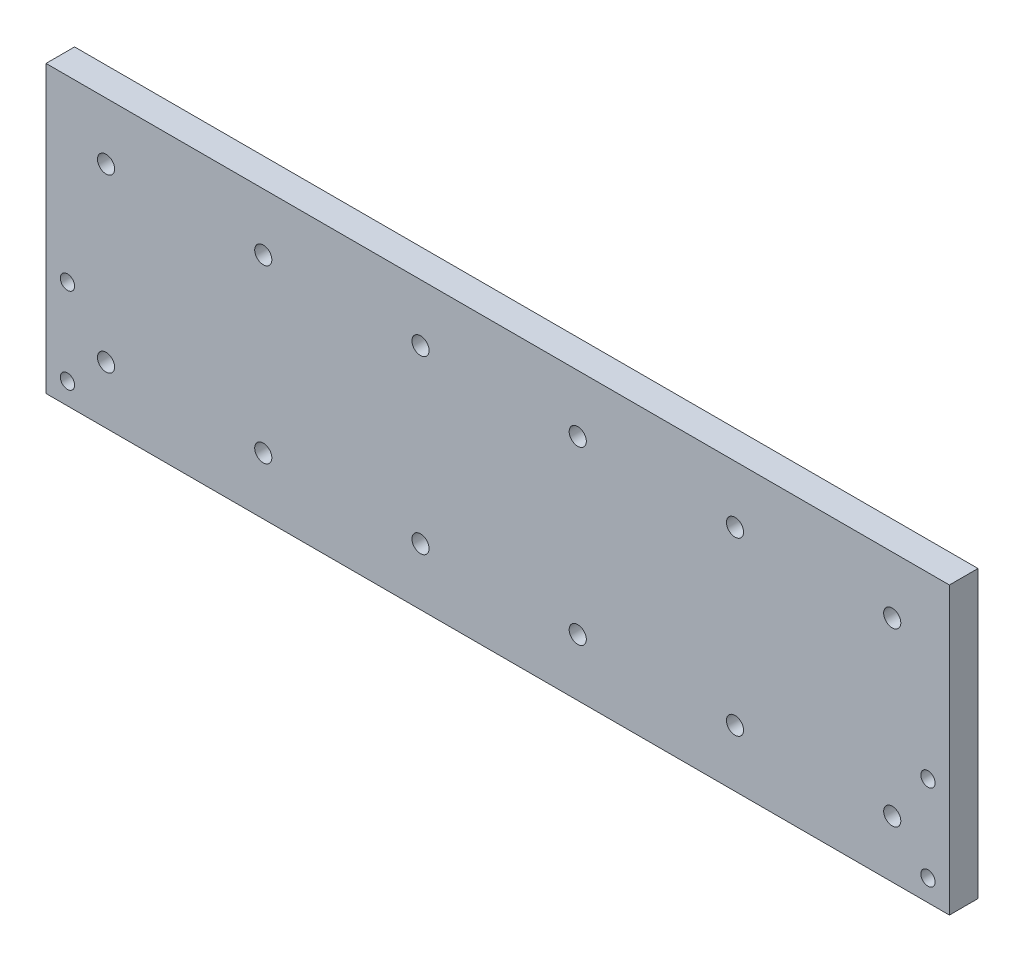
ISO-10303-21;
HEADER;
FILE_DESCRIPTION(('STEP AP214'),'2;1');
FILE_NAME('part.step','',(''),(''),'','','');
FILE_SCHEMA(('AUTOMOTIVE_DESIGN { 1 0 10303 214 1 1 1 1 }'));
ENDSEC;
DATA;
#1=APPLICATION_CONTEXT('core data for automotive mechanical design processes');
#2=APPLICATION_PROTOCOL_DEFINITION('international standard','automotive_design',2000,#1);
#3=PRODUCT_CONTEXT('',#1,'mechanical');
#4=PRODUCT('Part','Part','',(#3));
#5=PRODUCT_RELATED_PRODUCT_CATEGORY('part','',(#4));
#6=PRODUCT_DEFINITION_FORMATION('','',#4);
#7=PRODUCT_DEFINITION_CONTEXT('part definition',#1,'design');
#8=PRODUCT_DEFINITION('design','',#6,#7);
#9=PRODUCT_DEFINITION_SHAPE('','',#8);
#10=(LENGTH_UNIT() NAMED_UNIT(*) SI_UNIT(.MILLI.,.METRE.));
#11=(NAMED_UNIT(*) PLANE_ANGLE_UNIT() SI_UNIT($,.RADIAN.));
#12=(NAMED_UNIT(*) SI_UNIT($,.STERADIAN.) SOLID_ANGLE_UNIT());
#13=UNCERTAINTY_MEASURE_WITH_UNIT(LENGTH_MEASURE(1.E-05),#10,'distance_accuracy_value','');
#14=(GEOMETRIC_REPRESENTATION_CONTEXT(3) GLOBAL_UNCERTAINTY_ASSIGNED_CONTEXT((#13)) GLOBAL_UNIT_ASSIGNED_CONTEXT((#10,
#11,#12)) REPRESENTATION_CONTEXT('',''));
#15=CARTESIAN_POINT('',(0.,0.,0.));
#16=DIRECTION('',(0.,0.,1.));
#17=DIRECTION('',(1.,0.,0.));
#18=AXIS2_PLACEMENT_3D('',#15,#16,#17);
#19=CARTESIAN_POINT('',(-150.5,-42.5,-0.000999999999999265));
#20=DIRECTION('',(0.,0.,1.));
#21=DIRECTION('',(1.,0.,0.));
#22=AXIS2_PLACEMENT_3D('',#19,#20,#21);
#23=CYLINDRICAL_SURFACE('',#22,2.5);
#24=CARTESIAN_POINT('',(-150.5,-42.5,10.));
#25=DIRECTION('',(0.,0.,1.));
#26=DIRECTION('',(1.,0.,0.));
#27=AXIS2_PLACEMENT_3D('',#24,#25,#26);
#28=CIRCLE('',#27,2.5);
#29=CARTESIAN_POINT('',(-148.,-42.5,10.));
#30=VERTEX_POINT('',#29);
#31=EDGE_CURVE('E141',#30,#30,#28,.T.);
#32=ORIENTED_EDGE('',*,*,#31,.T.);
#33=EDGE_LOOP('',(#32));
#34=FACE_BOUND('',#33,.T.);
#35=CARTESIAN_POINT('',(-150.5,-42.5,5.));
#36=DIRECTION('',(0.,0.,-1.));
#37=DIRECTION('',(-1.,0.,0.));
#38=AXIS2_PLACEMENT_3D('',#35,#36,#37);
#39=CIRCLE('',#38,2.5);
#40=CARTESIAN_POINT('',(-153.,-42.5,5.));
#41=VERTEX_POINT('',#40);
#42=EDGE_CURVE('E42',#41,#41,#39,.F.);
#43=ORIENTED_EDGE('',*,*,#42,.F.);
#44=EDGE_LOOP('',(#43));
#45=FACE_BOUND('',#44,.T.);
#46=ADVANCED_FACE('F38',(#34,#45),#23,.F.);
#47=CARTESIAN_POINT('',(150.5,-12.5,-0.000999999999999265));
#48=DIRECTION('',(0.,0.,1.));
#49=DIRECTION('',(1.,0.,0.));
#50=AXIS2_PLACEMENT_3D('',#47,#48,#49);
#51=CYLINDRICAL_SURFACE('',#50,2.5);
#52=CARTESIAN_POINT('',(150.5,-12.5,10.));
#53=DIRECTION('',(0.,0.,1.));
#54=DIRECTION('',(1.,0.,0.));
#55=AXIS2_PLACEMENT_3D('',#52,#53,#54);
#56=CIRCLE('',#55,2.5);
#57=CARTESIAN_POINT('',(153.,-12.5,10.));
#58=VERTEX_POINT('',#57);
#59=EDGE_CURVE('E125',#58,#58,#56,.T.);
#60=ORIENTED_EDGE('',*,*,#59,.T.);
#61=EDGE_LOOP('',(#60));
#62=FACE_BOUND('',#61,.T.);
#63=CARTESIAN_POINT('',(150.5,-12.5,5.));
#64=DIRECTION('',(0.,0.,-1.));
#65=DIRECTION('',(-1.,0.,0.));
#66=AXIS2_PLACEMENT_3D('',#63,#64,#65);
#67=CIRCLE('',#66,2.5);
#68=CARTESIAN_POINT('',(148.,-12.5,5.));
#69=VERTEX_POINT('',#68);
#70=EDGE_CURVE('E120',#69,#69,#67,.F.);
#71=ORIENTED_EDGE('',*,*,#70,.F.);
#72=EDGE_LOOP('',(#71));
#73=FACE_BOUND('',#72,.T.);
#74=ADVANCED_FACE('F235',(#62,#73),#51,.F.);
#75=CARTESIAN_POINT('',(-150.5,-12.5,-0.000999999999999265));
#76=DIRECTION('',(0.,0.,1.));
#77=DIRECTION('',(1.,0.,0.));
#78=AXIS2_PLACEMENT_3D('',#75,#76,#77);
#79=CYLINDRICAL_SURFACE('',#78,2.5);
#80=CARTESIAN_POINT('',(-150.5,-12.5,10.));
#81=DIRECTION('',(0.,0.,1.));
#82=DIRECTION('',(1.,0.,0.));
#83=AXIS2_PLACEMENT_3D('',#80,#81,#82);
#84=CIRCLE('',#83,2.5);
#85=CARTESIAN_POINT('',(-148.,-12.5,10.));
#86=VERTEX_POINT('',#85);
#87=EDGE_CURVE('E129',#86,#86,#84,.T.);
#88=ORIENTED_EDGE('',*,*,#87,.T.);
#89=EDGE_LOOP('',(#88));
#90=FACE_BOUND('',#89,.T.);
#91=CARTESIAN_POINT('',(-150.5,-12.5,5.));
#92=DIRECTION('',(0.,0.,-1.));
#93=DIRECTION('',(-1.,0.,0.));
#94=AXIS2_PLACEMENT_3D('',#91,#92,#93);
#95=CIRCLE('',#94,2.5);
#96=CARTESIAN_POINT('',(-153.,-12.5,5.));
#97=VERTEX_POINT('',#96);
#98=EDGE_CURVE('E117',#97,#97,#95,.F.);
#99=ORIENTED_EDGE('',*,*,#98,.F.);
#100=EDGE_LOOP('',(#99));
#101=FACE_BOUND('',#100,.T.);
#102=ADVANCED_FACE('F241',(#90,#101),#79,.F.);
#103=CARTESIAN_POINT('',(150.5,-42.5,-0.000999999999999265));
#104=DIRECTION('',(0.,0.,1.));
#105=DIRECTION('',(1.,0.,0.));
#106=AXIS2_PLACEMENT_3D('',#103,#104,#105);
#107=CYLINDRICAL_SURFACE('',#106,2.5);
#108=CARTESIAN_POINT('',(150.5,-42.5,10.));
#109=DIRECTION('',(0.,0.,1.));
#110=DIRECTION('',(1.,0.,0.));
#111=AXIS2_PLACEMENT_3D('',#108,#109,#110);
#112=CIRCLE('',#111,2.5);
#113=CARTESIAN_POINT('',(153.,-42.5,10.));
#114=VERTEX_POINT('',#113);
#115=EDGE_CURVE('E134',#114,#114,#112,.T.);
#116=ORIENTED_EDGE('',*,*,#115,.T.);
#117=EDGE_LOOP('',(#116));
#118=FACE_BOUND('',#117,.T.);
#119=CARTESIAN_POINT('',(150.5,-42.5,5.));
#120=DIRECTION('',(0.,0.,-1.));
#121=DIRECTION('',(-1.,0.,0.));
#122=AXIS2_PLACEMENT_3D('',#119,#120,#121);
#123=CIRCLE('',#122,2.5);
#124=CARTESIAN_POINT('',(148.,-42.5,5.));
#125=VERTEX_POINT('',#124);
#126=EDGE_CURVE('E114',#125,#125,#123,.F.);
#127=ORIENTED_EDGE('',*,*,#126,.F.);
#128=EDGE_LOOP('',(#127));
#129=FACE_BOUND('',#128,.T.);
#130=ADVANCED_FACE('F301',(#118,#129),#107,.F.);
#131=CARTESIAN_POINT('',(158.,-50.,10.));
#132=DIRECTION('',(-1.,0.,0.));
#133=DIRECTION('',(0.,0.,1.));
#134=AXIS2_PLACEMENT_3D('',#131,#132,#133);
#135=PLANE('',#134);
#136=DIRECTION('',(0.,1.,0.));
#137=VECTOR('',#136,1.);
#138=CARTESIAN_POINT('',(158.,-50.,0.));
#139=LINE('',#138,#137);
#140=CARTESIAN_POINT('',(158.,-50.,0.));
#141=VERTEX_POINT('',#140);
#142=CARTESIAN_POINT('',(158.,50.,0.));
#143=VERTEX_POINT('',#142);
#144=EDGE_CURVE('E105',#141,#143,#139,.T.);
#145=ORIENTED_EDGE('',*,*,#144,.T.);
#146=DIRECTION('',(0.,0.,-1.));
#147=VECTOR('',#146,1.);
#148=CARTESIAN_POINT('',(158.,50.,10.));
#149=LINE('',#148,#147);
#150=CARTESIAN_POINT('',(158.,50.,10.));
#151=VERTEX_POINT('',#150);
#152=EDGE_CURVE('E11',#151,#143,#149,.T.);
#153=ORIENTED_EDGE('',*,*,#152,.F.);
#154=DIRECTION('',(0.,1.,0.));
#155=VECTOR('',#154,1.);
#156=CARTESIAN_POINT('',(158.,-50.,10.));
#157=LINE('',#156,#155);
#158=CARTESIAN_POINT('',(158.,-50.,10.));
#159=VERTEX_POINT('',#158);
#160=EDGE_CURVE('E92',#159,#151,#157,.T.);
#161=ORIENTED_EDGE('',*,*,#160,.F.);
#162=DIRECTION('',(0.,0.,-1.));
#163=VECTOR('',#162,1.);
#164=CARTESIAN_POINT('',(158.,-50.,10.));
#165=LINE('',#164,#163);
#166=EDGE_CURVE('E101',#159,#141,#165,.T.);
#167=ORIENTED_EDGE('',*,*,#166,.T.);
#168=EDGE_LOOP('',(#145,#153,#161,#167));
#169=FACE_BOUND('',#168,.T.);
#170=ADVANCED_FACE('F40',(#169),#135,.F.);
#171=CARTESIAN_POINT('',(-158.,50.,10.));
#172=DIRECTION('',(0.,-1.,0.));
#173=DIRECTION('',(0.,0.,-1.));
#174=AXIS2_PLACEMENT_3D('',#171,#172,#173);
#175=PLANE('',#174);
#176=DIRECTION('',(-1.,0.,0.));
#177=VECTOR('',#176,1.);
#178=CARTESIAN_POINT('',(-158.,50.,0.));
#179=LINE('',#178,#177);
#180=CARTESIAN_POINT('',(-158.,50.,0.));
#181=VERTEX_POINT('',#180);
#182=EDGE_CURVE('E96',#143,#181,#179,.T.);
#183=ORIENTED_EDGE('',*,*,#182,.T.);
#184=DIRECTION('',(0.,0.,-1.));
#185=VECTOR('',#184,1.);
#186=CARTESIAN_POINT('',(-158.,50.,10.));
#187=LINE('',#186,#185);
#188=CARTESIAN_POINT('',(-158.,50.,10.));
#189=VERTEX_POINT('',#188);
#190=EDGE_CURVE('E48',#189,#181,#187,.T.);
#191=ORIENTED_EDGE('',*,*,#190,.F.);
#192=DIRECTION('',(-1.,0.,0.));
#193=VECTOR('',#192,1.);
#194=CARTESIAN_POINT('',(-158.,50.,10.));
#195=LINE('',#194,#193);
#196=EDGE_CURVE('E87',#151,#189,#195,.T.);
#197=ORIENTED_EDGE('',*,*,#196,.F.);
#198=ORIENTED_EDGE('',*,*,#152,.T.);
#199=EDGE_LOOP('',(#183,#191,#197,#198));
#200=FACE_BOUND('',#199,.T.);
#201=ADVANCED_FACE('F95',(#200),#175,.F.);
#202=CARTESIAN_POINT('',(-158.,-50.,10.));
#203=DIRECTION('',(1.,0.,0.));
#204=DIRECTION('',(0.,0.,-1.));
#205=AXIS2_PLACEMENT_3D('',#202,#203,#204);
#206=PLANE('',#205);
#207=DIRECTION('',(0.,-1.,0.));
#208=VECTOR('',#207,1.);
#209=CARTESIAN_POINT('',(-158.,-50.,0.));
#210=LINE('',#209,#208);
#211=CARTESIAN_POINT('',(-158.,-50.,0.));
#212=VERTEX_POINT('',#211);
#213=EDGE_CURVE('E74',#181,#212,#210,.T.);
#214=ORIENTED_EDGE('',*,*,#213,.T.);
#215=DIRECTION('',(0.,0.,-1.));
#216=VECTOR('',#215,1.);
#217=CARTESIAN_POINT('',(-158.,-50.,10.));
#218=LINE('',#217,#216);
#219=CARTESIAN_POINT('',(-158.,-50.,10.));
#220=VERTEX_POINT('',#219);
#221=EDGE_CURVE('E97',#220,#212,#218,.T.);
#222=ORIENTED_EDGE('',*,*,#221,.F.);
#223=DIRECTION('',(0.,-1.,0.));
#224=VECTOR('',#223,1.);
#225=CARTESIAN_POINT('',(-158.,-50.,10.));
#226=LINE('',#225,#224);
#227=EDGE_CURVE('E90',#189,#220,#226,.T.);
#228=ORIENTED_EDGE('',*,*,#227,.F.);
#229=ORIENTED_EDGE('',*,*,#190,.T.);
#230=EDGE_LOOP('',(#214,#222,#228,#229));
#231=FACE_BOUND('',#230,.T.);
#232=ADVANCED_FACE('F99',(#231),#206,.F.);
#233=CARTESIAN_POINT('',(-158.,-50.,10.));
#234=DIRECTION('',(0.,1.,0.));
#235=DIRECTION('',(0.,0.,1.));
#236=AXIS2_PLACEMENT_3D('',#233,#234,#235);
#237=PLANE('',#236);
#238=DIRECTION('',(1.,0.,0.));
#239=VECTOR('',#238,1.);
#240=CARTESIAN_POINT('',(-158.,-50.,0.));
#241=LINE('',#240,#239);
#242=EDGE_CURVE('E80',#212,#141,#241,.T.);
#243=ORIENTED_EDGE('',*,*,#242,.T.);
#244=ORIENTED_EDGE('',*,*,#166,.F.);
#245=DIRECTION('',(1.,0.,0.));
#246=VECTOR('',#245,1.);
#247=CARTESIAN_POINT('',(-158.,-50.,10.));
#248=LINE('',#247,#246);
#249=EDGE_CURVE('E57',#220,#159,#248,.T.);
#250=ORIENTED_EDGE('',*,*,#249,.F.);
#251=ORIENTED_EDGE('',*,*,#221,.T.);
#252=EDGE_LOOP('',(#243,#244,#250,#251));
#253=FACE_BOUND('',#252,.T.);
#254=ADVANCED_FACE('F221',(#253),#237,.F.);
#255=CARTESIAN_POINT('',(0.,0.,10.));
#256=DIRECTION('',(0.,0.,-1.));
#257=DIRECTION('',(-1.,0.,0.));
#258=AXIS2_PLACEMENT_3D('',#255,#256,#257);
#259=PLANE('',#258);
#260=ORIENTED_EDGE('',*,*,#115,.F.);
#261=EDGE_LOOP('',(#260));
#262=FACE_BOUND('',#261,.T.);
#263=ORIENTED_EDGE('',*,*,#87,.F.);
#264=EDGE_LOOP('',(#263));
#265=FACE_BOUND('',#264,.T.);
#266=ORIENTED_EDGE('',*,*,#59,.F.);
#267=EDGE_LOOP('',(#266));
#268=FACE_BOUND('',#267,.T.);
#269=ORIENTED_EDGE('',*,*,#31,.F.);
#270=EDGE_LOOP('',(#269));
#271=FACE_BOUND('',#270,.T.);
#272=CARTESIAN_POINT('',(-26.9999999999999,-30.,10.));
#273=DIRECTION('',(0.,0.,-1.));
#274=DIRECTION('',(-1.,0.,0.));
#275=AXIS2_PLACEMENT_3D('',#272,#273,#274);
#276=CIRCLE('',#275,3.);
#277=CARTESIAN_POINT('',(-29.9999999999999,-30.,10.));
#278=VERTEX_POINT('',#277);
#279=EDGE_CURVE('E181',#278,#278,#276,.F.);
#280=ORIENTED_EDGE('',*,*,#279,.F.);
#281=EDGE_LOOP('',(#280));
#282=FACE_BOUND('',#281,.T.);
#283=CARTESIAN_POINT('',(-81.9999999999999,-30.,10.));
#284=DIRECTION('',(0.,0.,-1.));
#285=DIRECTION('',(-1.,0.,0.));
#286=AXIS2_PLACEMENT_3D('',#283,#284,#285);
#287=CIRCLE('',#286,3.00000000000001);
#288=CARTESIAN_POINT('',(-84.9999999999999,-30.,10.));
#289=VERTEX_POINT('',#288);
#290=EDGE_CURVE('E175',#289,#289,#287,.F.);
#291=ORIENTED_EDGE('',*,*,#290,.F.);
#292=EDGE_LOOP('',(#291));
#293=FACE_BOUND('',#292,.T.);
#294=CARTESIAN_POINT('',(-137.,30.,10.));
#295=DIRECTION('',(0.,0.,-1.));
#296=DIRECTION('',(-1.,0.,0.));
#297=AXIS2_PLACEMENT_3D('',#294,#295,#296);
#298=CIRCLE('',#297,2.99999999999999);
#299=CARTESIAN_POINT('',(-140.,30.,10.));
#300=VERTEX_POINT('',#299);
#301=EDGE_CURVE('E168',#300,#300,#298,.F.);
#302=ORIENTED_EDGE('',*,*,#301,.F.);
#303=EDGE_LOOP('',(#302));
#304=FACE_BOUND('',#303,.T.);
#305=CARTESIAN_POINT('',(-81.9999999999999,30.,10.));
#306=DIRECTION('',(0.,0.,-1.));
#307=DIRECTION('',(-1.,0.,0.));
#308=AXIS2_PLACEMENT_3D('',#305,#306,#307);
#309=CIRCLE('',#308,3.00000000000001);
#310=CARTESIAN_POINT('',(-84.9999999999999,30.,10.));
#311=VERTEX_POINT('',#310);
#312=EDGE_CURVE('E167',#311,#311,#309,.F.);
#313=ORIENTED_EDGE('',*,*,#312,.F.);
#314=EDGE_LOOP('',(#313));
#315=FACE_BOUND('',#314,.T.);
#316=CARTESIAN_POINT('',(-137.,-30.,10.));
#317=DIRECTION('',(0.,0.,-1.));
#318=DIRECTION('',(-1.,0.,0.));
#319=AXIS2_PLACEMENT_3D('',#316,#317,#318);
#320=CIRCLE('',#319,2.99999999999999);
#321=CARTESIAN_POINT('',(-140.,-30.,10.));
#322=VERTEX_POINT('',#321);
#323=EDGE_CURVE('E203',#322,#322,#320,.F.);
#324=ORIENTED_EDGE('',*,*,#323,.F.);
#325=EDGE_LOOP('',(#324));
#326=FACE_BOUND('',#325,.T.);
#327=CARTESIAN_POINT('',(83.,30.,10.));
#328=DIRECTION('',(0.,0.,-1.));
#329=DIRECTION('',(-1.,0.,0.));
#330=AXIS2_PLACEMENT_3D('',#327,#328,#329);
#331=CIRCLE('',#330,3.00000000000001);
#332=CARTESIAN_POINT('',(80.,30.,10.));
#333=VERTEX_POINT('',#332);
#334=EDGE_CURVE('E204',#333,#333,#331,.F.);
#335=ORIENTED_EDGE('',*,*,#334,.F.);
#336=EDGE_LOOP('',(#335));
#337=FACE_BOUND('',#336,.T.);
#338=CARTESIAN_POINT('',(28.0000000000001,30.,10.));
#339=DIRECTION('',(0.,0.,-1.));
#340=DIRECTION('',(-1.,0.,0.));
#341=AXIS2_PLACEMENT_3D('',#338,#339,#340);
#342=CIRCLE('',#341,3.);
#343=CARTESIAN_POINT('',(25.,30.,10.));
#344=VERTEX_POINT('',#343);
#345=EDGE_CURVE('E191',#344,#344,#342,.F.);
#346=ORIENTED_EDGE('',*,*,#345,.F.);
#347=EDGE_LOOP('',(#346));
#348=FACE_BOUND('',#347,.T.);
#349=CARTESIAN_POINT('',(-26.9999999999999,30.,10.));
#350=DIRECTION('',(0.,0.,-1.));
#351=DIRECTION('',(-1.,0.,0.));
#352=AXIS2_PLACEMENT_3D('',#349,#350,#351);
#353=CIRCLE('',#352,3.);
#354=CARTESIAN_POINT('',(-29.9999999999999,30.,10.));
#355=VERTEX_POINT('',#354);
#356=EDGE_CURVE('E192',#355,#355,#353,.F.);
#357=ORIENTED_EDGE('',*,*,#356,.F.);
#358=EDGE_LOOP('',(#357));
#359=FACE_BOUND('',#358,.T.);
#360=CARTESIAN_POINT('',(28.0000000000001,-30.,10.));
#361=DIRECTION('',(0.,0.,-1.));
#362=DIRECTION('',(-1.,0.,0.));
#363=AXIS2_PLACEMENT_3D('',#360,#361,#362);
#364=CIRCLE('',#363,3.);
#365=CARTESIAN_POINT('',(25.,-30.,10.));
#366=VERTEX_POINT('',#365);
#367=EDGE_CURVE('E149',#366,#366,#364,.F.);
#368=ORIENTED_EDGE('',*,*,#367,.F.);
#369=EDGE_LOOP('',(#368));
#370=FACE_BOUND('',#369,.T.);
#371=CARTESIAN_POINT('',(83.,-30.,10.));
#372=DIRECTION('',(0.,0.,-1.));
#373=DIRECTION('',(-1.,0.,0.));
#374=AXIS2_PLACEMENT_3D('',#371,#372,#373);
#375=CIRCLE('',#374,3.00000000000001);
#376=CARTESIAN_POINT('',(80.,-30.,10.));
#377=VERTEX_POINT('',#376);
#378=EDGE_CURVE('E150',#377,#377,#375,.F.);
#379=ORIENTED_EDGE('',*,*,#378,.F.);
#380=EDGE_LOOP('',(#379));
#381=FACE_BOUND('',#380,.T.);
#382=CARTESIAN_POINT('',(138.,-30.,10.));
#383=DIRECTION('',(0.,0.,-1.));
#384=DIRECTION('',(-1.,0.,0.));
#385=AXIS2_PLACEMENT_3D('',#382,#383,#384);
#386=CIRCLE('',#385,2.99999999999999);
#387=CARTESIAN_POINT('',(135.,-30.,10.));
#388=VERTEX_POINT('',#387);
#389=EDGE_CURVE('E157',#388,#388,#386,.F.);
#390=ORIENTED_EDGE('',*,*,#389,.F.);
#391=EDGE_LOOP('',(#390));
#392=FACE_BOUND('',#391,.T.);
#393=CARTESIAN_POINT('',(138.,30.,10.));
#394=DIRECTION('',(0.,0.,-1.));
#395=DIRECTION('',(-1.,0.,0.));
#396=AXIS2_PLACEMENT_3D('',#393,#394,#395);
#397=CIRCLE('',#396,2.99999999999999);
#398=CARTESIAN_POINT('',(135.,30.,10.));
#399=VERTEX_POINT('',#398);
#400=EDGE_CURVE('E108',#399,#399,#397,.F.);
#401=ORIENTED_EDGE('',*,*,#400,.F.);
#402=EDGE_LOOP('',(#401));
#403=FACE_BOUND('',#402,.T.);
#404=ORIENTED_EDGE('',*,*,#160,.T.);
#405=ORIENTED_EDGE('',*,*,#196,.T.);
#406=ORIENTED_EDGE('',*,*,#227,.T.);
#407=ORIENTED_EDGE('',*,*,#249,.T.);
#408=EDGE_LOOP('',(#404,#405,#406,#407));
#409=FACE_BOUND('',#408,.T.);
#410=ADVANCED_FACE('F88',(#262,#265,#268,#271,#282,#293,#304,#315,#326,#337,#348,#359,#370,#381,
#392,#403,#409),#259,.F.);
#411=CARTESIAN_POINT('',(0.,0.,0.));
#412=DIRECTION('',(0.,0.,-1.));
#413=DIRECTION('',(-1.,0.,0.));
#414=AXIS2_PLACEMENT_3D('',#411,#412,#413);
#415=PLANE('',#414);
#416=CARTESIAN_POINT('',(-150.5,-42.5,0.));
#417=DIRECTION('',(0.,0.,-1.));
#418=DIRECTION('',(-1.,0.,0.));
#419=AXIS2_PLACEMENT_3D('',#416,#417,#418);
#420=CIRCLE('',#419,4.49999999999999);
#421=CARTESIAN_POINT('',(-155.,-42.5,0.));
#422=VERTEX_POINT('',#421);
#423=EDGE_CURVE('E363',#422,#422,#420,.T.);
#424=ORIENTED_EDGE('',*,*,#423,.F.);
#425=EDGE_LOOP('',(#424));
#426=FACE_BOUND('',#425,.T.);
#427=CARTESIAN_POINT('',(-150.5,-12.5,0.));
#428=DIRECTION('',(0.,0.,-1.));
#429=DIRECTION('',(-1.,0.,0.));
#430=AXIS2_PLACEMENT_3D('',#427,#428,#429);
#431=CIRCLE('',#430,4.49999999999999);
#432=CARTESIAN_POINT('',(-155.,-12.5,0.));
#433=VERTEX_POINT('',#432);
#434=EDGE_CURVE('E357',#433,#433,#431,.T.);
#435=ORIENTED_EDGE('',*,*,#434,.F.);
#436=EDGE_LOOP('',(#435));
#437=FACE_BOUND('',#436,.T.);
#438=CARTESIAN_POINT('',(150.5,-12.5,0.));
#439=DIRECTION('',(0.,0.,-1.));
#440=DIRECTION('',(-1.,0.,0.));
#441=AXIS2_PLACEMENT_3D('',#438,#439,#440);
#442=CIRCLE('',#441,4.49999999999999);
#443=CARTESIAN_POINT('',(146.,-12.5,0.));
#444=VERTEX_POINT('',#443);
#445=EDGE_CURVE('E348',#444,#444,#442,.T.);
#446=ORIENTED_EDGE('',*,*,#445,.F.);
#447=EDGE_LOOP('',(#446));
#448=FACE_BOUND('',#447,.T.);
#449=CARTESIAN_POINT('',(150.5,-42.5,0.));
#450=DIRECTION('',(0.,0.,-1.));
#451=DIRECTION('',(-1.,0.,0.));
#452=AXIS2_PLACEMENT_3D('',#449,#450,#451);
#453=CIRCLE('',#452,4.49999999999999);
#454=CARTESIAN_POINT('',(146.,-42.5,0.));
#455=VERTEX_POINT('',#454);
#456=EDGE_CURVE('E138',#455,#455,#453,.T.);
#457=ORIENTED_EDGE('',*,*,#456,.F.);
#458=EDGE_LOOP('',(#457));
#459=FACE_BOUND('',#458,.T.);
#460=CARTESIAN_POINT('',(-26.9999999999999,-30.,0.));
#461=DIRECTION('',(0.,0.,-1.));
#462=DIRECTION('',(1.,0.,0.));
#463=AXIS2_PLACEMENT_3D('',#460,#461,#462);
#464=CIRCLE('',#463,3.);
#465=CARTESIAN_POINT('',(-23.9999999999999,-30.,0.));
#466=VERTEX_POINT('',#465);
#467=EDGE_CURVE('E153',#466,#466,#464,.T.);
#468=ORIENTED_EDGE('',*,*,#467,.F.);
#469=EDGE_LOOP('',(#468));
#470=FACE_BOUND('',#469,.T.);
#471=CARTESIAN_POINT('',(-81.9999999999999,-30.,0.));
#472=DIRECTION('',(0.,0.,-1.));
#473=DIRECTION('',(1.,0.,0.));
#474=AXIS2_PLACEMENT_3D('',#471,#472,#473);
#475=CIRCLE('',#474,3.00000000000001);
#476=CARTESIAN_POINT('',(-78.9999999999999,-30.,0.));
#477=VERTEX_POINT('',#476);
#478=EDGE_CURVE('E178',#477,#477,#475,.T.);
#479=ORIENTED_EDGE('',*,*,#478,.F.);
#480=EDGE_LOOP('',(#479));
#481=FACE_BOUND('',#480,.T.);
#482=CARTESIAN_POINT('',(-137.,30.,0.));
#483=DIRECTION('',(0.,0.,-1.));
#484=DIRECTION('',(-1.,0.,0.));
#485=AXIS2_PLACEMENT_3D('',#482,#483,#484);
#486=CIRCLE('',#485,2.99999999999999);
#487=CARTESIAN_POINT('',(-140.,30.,0.));
#488=VERTEX_POINT('',#487);
#489=EDGE_CURVE('E172',#488,#488,#486,.T.);
#490=ORIENTED_EDGE('',*,*,#489,.F.);
#491=EDGE_LOOP('',(#490));
#492=FACE_BOUND('',#491,.T.);
#493=CARTESIAN_POINT('',(-81.9999999999999,30.,0.));
#494=DIRECTION('',(0.,0.,-1.));
#495=DIRECTION('',(-1.,0.,0.));
#496=AXIS2_PLACEMENT_3D('',#493,#494,#495);
#497=CIRCLE('',#496,3.00000000000001);
#498=CARTESIAN_POINT('',(-84.9999999999999,30.,0.));
#499=VERTEX_POINT('',#498);
#500=EDGE_CURVE('E164',#499,#499,#497,.T.);
#501=ORIENTED_EDGE('',*,*,#500,.F.);
#502=EDGE_LOOP('',(#501));
#503=FACE_BOUND('',#502,.T.);
#504=CARTESIAN_POINT('',(-137.,-30.,0.));
#505=DIRECTION('',(0.,0.,-1.));
#506=DIRECTION('',(1.,0.,0.));
#507=AXIS2_PLACEMENT_3D('',#504,#505,#506);
#508=CIRCLE('',#507,2.99999999999999);
#509=CARTESIAN_POINT('',(-134.,-30.,0.));
#510=VERTEX_POINT('',#509);
#511=EDGE_CURVE('E200',#510,#510,#508,.T.);
#512=ORIENTED_EDGE('',*,*,#511,.F.);
#513=EDGE_LOOP('',(#512));
#514=FACE_BOUND('',#513,.T.);
#515=CARTESIAN_POINT('',(83.,30.,0.));
#516=DIRECTION('',(0.,0.,-1.));
#517=DIRECTION('',(-1.,0.,0.));
#518=AXIS2_PLACEMENT_3D('',#515,#516,#517);
#519=CIRCLE('',#518,3.00000000000001);
#520=CARTESIAN_POINT('',(80.,30.,0.));
#521=VERTEX_POINT('',#520);
#522=EDGE_CURVE('E195',#521,#521,#519,.T.);
#523=ORIENTED_EDGE('',*,*,#522,.F.);
#524=EDGE_LOOP('',(#523));
#525=FACE_BOUND('',#524,.T.);
#526=CARTESIAN_POINT('',(28.0000000000001,30.,0.));
#527=DIRECTION('',(0.,0.,-1.));
#528=DIRECTION('',(-1.,0.,0.));
#529=AXIS2_PLACEMENT_3D('',#526,#527,#528);
#530=CIRCLE('',#529,3.);
#531=CARTESIAN_POINT('',(25.,30.,0.));
#532=VERTEX_POINT('',#531);
#533=EDGE_CURVE('E188',#532,#532,#530,.T.);
#534=ORIENTED_EDGE('',*,*,#533,.F.);
#535=EDGE_LOOP('',(#534));
#536=FACE_BOUND('',#535,.T.);
#537=CARTESIAN_POINT('',(-26.9999999999999,30.,0.));
#538=DIRECTION('',(0.,0.,-1.));
#539=DIRECTION('',(-1.,0.,0.));
#540=AXIS2_PLACEMENT_3D('',#537,#538,#539);
#541=CIRCLE('',#540,3.);
#542=CARTESIAN_POINT('',(-29.9999999999999,30.,0.));
#543=VERTEX_POINT('',#542);
#544=EDGE_CURVE('E171',#543,#543,#541,.T.);
#545=ORIENTED_EDGE('',*,*,#544,.F.);
#546=EDGE_LOOP('',(#545));
#547=FACE_BOUND('',#546,.T.);
#548=CARTESIAN_POINT('',(28.0000000000001,-30.,0.));
#549=DIRECTION('',(0.,0.,-1.));
#550=DIRECTION('',(1.,0.,0.));
#551=AXIS2_PLACEMENT_3D('',#548,#549,#550);
#552=CIRCLE('',#551,3.);
#553=CARTESIAN_POINT('',(31.0000000000001,-30.,0.));
#554=VERTEX_POINT('',#553);
#555=EDGE_CURVE('E146',#554,#554,#552,.T.);
#556=ORIENTED_EDGE('',*,*,#555,.F.);
#557=EDGE_LOOP('',(#556));
#558=FACE_BOUND('',#557,.T.);
#559=CARTESIAN_POINT('',(83.,-30.,0.));
#560=DIRECTION('',(0.,0.,-1.));
#561=DIRECTION('',(1.,0.,0.));
#562=AXIS2_PLACEMENT_3D('',#559,#560,#561);
#563=CIRCLE('',#562,3.00000000000001);
#564=CARTESIAN_POINT('',(86.,-30.,0.));
#565=VERTEX_POINT('',#564);
#566=EDGE_CURVE('E154',#565,#565,#563,.T.);
#567=ORIENTED_EDGE('',*,*,#566,.F.);
#568=EDGE_LOOP('',(#567));
#569=FACE_BOUND('',#568,.T.);
#570=CARTESIAN_POINT('',(138.,-30.,0.));
#571=DIRECTION('',(0.,0.,-1.));
#572=DIRECTION('',(1.,0.,0.));
#573=AXIS2_PLACEMENT_3D('',#570,#571,#572);
#574=CIRCLE('',#573,2.99999999999999);
#575=CARTESIAN_POINT('',(141.,-30.,0.));
#576=VERTEX_POINT('',#575);
#577=EDGE_CURVE('E145',#576,#576,#574,.T.);
#578=ORIENTED_EDGE('',*,*,#577,.F.);
#579=EDGE_LOOP('',(#578));
#580=FACE_BOUND('',#579,.T.);
#581=CARTESIAN_POINT('',(138.,30.,0.));
#582=DIRECTION('',(0.,0.,-1.));
#583=DIRECTION('',(-1.,0.,0.));
#584=AXIS2_PLACEMENT_3D('',#581,#582,#583);
#585=CIRCLE('',#584,2.99999999999999);
#586=CARTESIAN_POINT('',(135.,30.,0.));
#587=VERTEX_POINT('',#586);
#588=EDGE_CURVE('E207',#587,#587,#585,.T.);
#589=ORIENTED_EDGE('',*,*,#588,.F.);
#590=EDGE_LOOP('',(#589));
#591=FACE_BOUND('',#590,.T.);
#592=ORIENTED_EDGE('',*,*,#144,.F.);
#593=ORIENTED_EDGE('',*,*,#242,.F.);
#594=ORIENTED_EDGE('',*,*,#213,.F.);
#595=ORIENTED_EDGE('',*,*,#182,.F.);
#596=EDGE_LOOP('',(#592,#593,#594,#595));
#597=FACE_BOUND('',#596,.T.);
#598=ADVANCED_FACE('F220',(#426,#437,#448,#459,#470,#481,#492,#503,#514,#525,#536,#547,#558,
#569,#580,#591,#597),#415,.T.);
#599=CARTESIAN_POINT('',(138.,30.,10.001));
#600=DIRECTION('',(0.,0.,-1.));
#601=DIRECTION('',(-1.,0.,0.));
#602=AXIS2_PLACEMENT_3D('',#599,#600,#601);
#603=CYLINDRICAL_SURFACE('',#602,2.99999999999999);
#604=ORIENTED_EDGE('',*,*,#588,.T.);
#605=EDGE_LOOP('',(#604));
#606=FACE_BOUND('',#605,.T.);
#607=ORIENTED_EDGE('',*,*,#400,.T.);
#608=EDGE_LOOP('',(#607));
#609=FACE_BOUND('',#608,.T.);
#610=ADVANCED_FACE('F217',(#606,#609),#603,.F.);
#611=CARTESIAN_POINT('',(138.,-30.,10.001));
#612=DIRECTION('',(0.,0.,-1.));
#613=DIRECTION('',(-1.,0.,0.));
#614=AXIS2_PLACEMENT_3D('',#611,#612,#613);
#615=CYLINDRICAL_SURFACE('',#614,2.99999999999999);
#616=ORIENTED_EDGE('',*,*,#577,.T.);
#617=EDGE_LOOP('',(#616));
#618=FACE_BOUND('',#617,.T.);
#619=ORIENTED_EDGE('',*,*,#389,.T.);
#620=EDGE_LOOP('',(#619));
#621=FACE_BOUND('',#620,.T.);
#622=ADVANCED_FACE('F255',(#618,#621),#615,.F.);
#623=CARTESIAN_POINT('',(83.,-30.,10.001));
#624=DIRECTION('',(0.,0.,-1.));
#625=DIRECTION('',(-1.,0.,0.));
#626=AXIS2_PLACEMENT_3D('',#623,#624,#625);
#627=CYLINDRICAL_SURFACE('',#626,3.00000000000001);
#628=ORIENTED_EDGE('',*,*,#566,.T.);
#629=EDGE_LOOP('',(#628));
#630=FACE_BOUND('',#629,.T.);
#631=ORIENTED_EDGE('',*,*,#378,.T.);
#632=EDGE_LOOP('',(#631));
#633=FACE_BOUND('',#632,.T.);
#634=ADVANCED_FACE('F251',(#630,#633),#627,.F.);
#635=CARTESIAN_POINT('',(28.0000000000001,-30.,10.001));
#636=DIRECTION('',(0.,0.,-1.));
#637=DIRECTION('',(-1.,0.,0.));
#638=AXIS2_PLACEMENT_3D('',#635,#636,#637);
#639=CYLINDRICAL_SURFACE('',#638,3.);
#640=ORIENTED_EDGE('',*,*,#555,.T.);
#641=EDGE_LOOP('',(#640));
#642=FACE_BOUND('',#641,.T.);
#643=ORIENTED_EDGE('',*,*,#367,.T.);
#644=EDGE_LOOP('',(#643));
#645=FACE_BOUND('',#644,.T.);
#646=ADVANCED_FACE('F247',(#642,#645),#639,.F.);
#647=CARTESIAN_POINT('',(-26.9999999999999,30.,10.001));
#648=DIRECTION('',(0.,0.,-1.));
#649=DIRECTION('',(-1.,0.,0.));
#650=AXIS2_PLACEMENT_3D('',#647,#648,#649);
#651=CYLINDRICAL_SURFACE('',#650,3.);
#652=ORIENTED_EDGE('',*,*,#544,.T.);
#653=EDGE_LOOP('',(#652));
#654=FACE_BOUND('',#653,.T.);
#655=ORIENTED_EDGE('',*,*,#356,.T.);
#656=EDGE_LOOP('',(#655));
#657=FACE_BOUND('',#656,.T.);
#658=ADVANCED_FACE('F250',(#654,#657),#651,.F.);
#659=CARTESIAN_POINT('',(28.0000000000001,30.,10.001));
#660=DIRECTION('',(0.,0.,-1.));
#661=DIRECTION('',(-1.,0.,0.));
#662=AXIS2_PLACEMENT_3D('',#659,#660,#661);
#663=CYLINDRICAL_SURFACE('',#662,3.);
#664=ORIENTED_EDGE('',*,*,#533,.T.);
#665=EDGE_LOOP('',(#664));
#666=FACE_BOUND('',#665,.T.);
#667=ORIENTED_EDGE('',*,*,#345,.T.);
#668=EDGE_LOOP('',(#667));
#669=FACE_BOUND('',#668,.T.);
#670=ADVANCED_FACE('F278',(#666,#669),#663,.F.);
#671=CARTESIAN_POINT('',(83.,30.,10.001));
#672=DIRECTION('',(0.,0.,-1.));
#673=DIRECTION('',(-1.,0.,0.));
#674=AXIS2_PLACEMENT_3D('',#671,#672,#673);
#675=CYLINDRICAL_SURFACE('',#674,3.00000000000001);
#676=ORIENTED_EDGE('',*,*,#522,.T.);
#677=EDGE_LOOP('',(#676));
#678=FACE_BOUND('',#677,.T.);
#679=ORIENTED_EDGE('',*,*,#334,.T.);
#680=EDGE_LOOP('',(#679));
#681=FACE_BOUND('',#680,.T.);
#682=ADVANCED_FACE('F281',(#678,#681),#675,.F.);
#683=CARTESIAN_POINT('',(-137.,-30.,10.001));
#684=DIRECTION('',(0.,0.,-1.));
#685=DIRECTION('',(-1.,0.,0.));
#686=AXIS2_PLACEMENT_3D('',#683,#684,#685);
#687=CYLINDRICAL_SURFACE('',#686,2.99999999999999);
#688=ORIENTED_EDGE('',*,*,#511,.T.);
#689=EDGE_LOOP('',(#688));
#690=FACE_BOUND('',#689,.T.);
#691=ORIENTED_EDGE('',*,*,#323,.T.);
#692=EDGE_LOOP('',(#691));
#693=FACE_BOUND('',#692,.T.);
#694=ADVANCED_FACE('F264',(#690,#693),#687,.F.);
#695=CARTESIAN_POINT('',(-81.9999999999999,30.,10.001));
#696=DIRECTION('',(0.,0.,-1.));
#697=DIRECTION('',(-1.,0.,0.));
#698=AXIS2_PLACEMENT_3D('',#695,#696,#697);
#699=CYLINDRICAL_SURFACE('',#698,3.00000000000001);
#700=ORIENTED_EDGE('',*,*,#500,.T.);
#701=EDGE_LOOP('',(#700));
#702=FACE_BOUND('',#701,.T.);
#703=ORIENTED_EDGE('',*,*,#312,.T.);
#704=EDGE_LOOP('',(#703));
#705=FACE_BOUND('',#704,.T.);
#706=ADVANCED_FACE('F260',(#702,#705),#699,.F.);
#707=CARTESIAN_POINT('',(-137.,30.,10.001));
#708=DIRECTION('',(0.,0.,-1.));
#709=DIRECTION('',(-1.,0.,0.));
#710=AXIS2_PLACEMENT_3D('',#707,#708,#709);
#711=CYLINDRICAL_SURFACE('',#710,2.99999999999999);
#712=ORIENTED_EDGE('',*,*,#489,.T.);
#713=EDGE_LOOP('',(#712));
#714=FACE_BOUND('',#713,.T.);
#715=ORIENTED_EDGE('',*,*,#301,.T.);
#716=EDGE_LOOP('',(#715));
#717=FACE_BOUND('',#716,.T.);
#718=ADVANCED_FACE('F263',(#714,#717),#711,.F.);
#719=CARTESIAN_POINT('',(-81.9999999999999,-30.,10.001));
#720=DIRECTION('',(0.,0.,-1.));
#721=DIRECTION('',(-1.,0.,0.));
#722=AXIS2_PLACEMENT_3D('',#719,#720,#721);
#723=CYLINDRICAL_SURFACE('',#722,3.00000000000001);
#724=ORIENTED_EDGE('',*,*,#478,.T.);
#725=EDGE_LOOP('',(#724));
#726=FACE_BOUND('',#725,.T.);
#727=ORIENTED_EDGE('',*,*,#290,.T.);
#728=EDGE_LOOP('',(#727));
#729=FACE_BOUND('',#728,.T.);
#730=ADVANCED_FACE('F268',(#726,#729),#723,.F.);
#731=CARTESIAN_POINT('',(-26.9999999999999,-30.,10.001));
#732=DIRECTION('',(0.,0.,-1.));
#733=DIRECTION('',(-1.,0.,0.));
#734=AXIS2_PLACEMENT_3D('',#731,#732,#733);
#735=CYLINDRICAL_SURFACE('',#734,3.);
#736=ORIENTED_EDGE('',*,*,#467,.T.);
#737=EDGE_LOOP('',(#736));
#738=FACE_BOUND('',#737,.T.);
#739=ORIENTED_EDGE('',*,*,#279,.T.);
#740=EDGE_LOOP('',(#739));
#741=FACE_BOUND('',#740,.T.);
#742=ADVANCED_FACE('F272',(#738,#741),#735,.F.);
#743=CARTESIAN_POINT('',(150.5,-42.5,5.));
#744=DIRECTION('',(0.,0.,-1.));
#745=DIRECTION('',(-1.,0.,0.));
#746=AXIS2_PLACEMENT_3D('',#743,#744,#745);
#747=PLANE('',#746);
#748=CARTESIAN_POINT('',(150.5,-42.5,5.));
#749=DIRECTION('',(0.,0.,-1.));
#750=DIRECTION('',(-1.,0.,0.));
#751=AXIS2_PLACEMENT_3D('',#748,#749,#750);
#752=CIRCLE('',#751,4.49999999999999);
#753=CARTESIAN_POINT('',(146.,-42.5,5.));
#754=VERTEX_POINT('',#753);
#755=EDGE_CURVE('E118',#754,#754,#752,.T.);
#756=ORIENTED_EDGE('',*,*,#755,.T.);
#757=EDGE_LOOP('',(#756));
#758=FACE_BOUND('',#757,.T.);
#759=ORIENTED_EDGE('',*,*,#126,.T.);
#760=EDGE_LOOP('',(#759));
#761=FACE_BOUND('',#760,.T.);
#762=ADVANCED_FACE('F276',(#758,#761),#747,.T.);
#763=CARTESIAN_POINT('',(150.5,-42.5,5.));
#764=DIRECTION('',(0.,0.,-1.));
#765=DIRECTION('',(-1.,0.,0.));
#766=AXIS2_PLACEMENT_3D('',#763,#764,#765);
#767=CYLINDRICAL_SURFACE('',#766,4.49999999999999);
#768=ORIENTED_EDGE('',*,*,#755,.F.);
#769=EDGE_LOOP('',(#768));
#770=FACE_BOUND('',#769,.T.);
#771=ORIENTED_EDGE('',*,*,#456,.T.);
#772=EDGE_LOOP('',(#771));
#773=FACE_BOUND('',#772,.T.);
#774=ADVANCED_FACE('F313',(#770,#773),#767,.F.);
#775=CARTESIAN_POINT('',(-150.5,-12.5,5.));
#776=DIRECTION('',(0.,0.,-1.));
#777=DIRECTION('',(-1.,0.,0.));
#778=AXIS2_PLACEMENT_3D('',#775,#776,#777);
#779=PLANE('',#778);
#780=CARTESIAN_POINT('',(-150.5,-12.5,5.));
#781=DIRECTION('',(0.,0.,-1.));
#782=DIRECTION('',(-1.,0.,0.));
#783=AXIS2_PLACEMENT_3D('',#780,#781,#782);
#784=CIRCLE('',#783,4.49999999999999);
#785=CARTESIAN_POINT('',(-155.,-12.5,5.));
#786=VERTEX_POINT('',#785);
#787=EDGE_CURVE('E352',#786,#786,#784,.T.);
#788=ORIENTED_EDGE('',*,*,#787,.T.);
#789=EDGE_LOOP('',(#788));
#790=FACE_BOUND('',#789,.T.);
#791=ORIENTED_EDGE('',*,*,#98,.T.);
#792=EDGE_LOOP('',(#791));
#793=FACE_BOUND('',#792,.T.);
#794=ADVANCED_FACE('F316',(#790,#793),#779,.T.);
#795=CARTESIAN_POINT('',(-150.5,-12.5,5.));
#796=DIRECTION('',(0.,0.,-1.));
#797=DIRECTION('',(-1.,0.,0.));
#798=AXIS2_PLACEMENT_3D('',#795,#796,#797);
#799=CYLINDRICAL_SURFACE('',#798,4.49999999999999);
#800=ORIENTED_EDGE('',*,*,#787,.F.);
#801=EDGE_LOOP('',(#800));
#802=FACE_BOUND('',#801,.T.);
#803=ORIENTED_EDGE('',*,*,#434,.T.);
#804=EDGE_LOOP('',(#803));
#805=FACE_BOUND('',#804,.T.);
#806=ADVANCED_FACE('F330',(#802,#805),#799,.F.);
#807=CARTESIAN_POINT('',(150.5,-12.5,5.));
#808=DIRECTION('',(0.,0.,-1.));
#809=DIRECTION('',(-1.,0.,0.));
#810=AXIS2_PLACEMENT_3D('',#807,#808,#809);
#811=PLANE('',#810);
#812=CARTESIAN_POINT('',(150.5,-12.5,5.));
#813=DIRECTION('',(0.,0.,-1.));
#814=DIRECTION('',(-1.,0.,0.));
#815=AXIS2_PLACEMENT_3D('',#812,#813,#814);
#816=CIRCLE('',#815,4.49999999999999);
#817=CARTESIAN_POINT('',(146.,-12.5,5.));
#818=VERTEX_POINT('',#817);
#819=EDGE_CURVE('E347',#818,#818,#816,.T.);
#820=ORIENTED_EDGE('',*,*,#819,.T.);
#821=EDGE_LOOP('',(#820));
#822=FACE_BOUND('',#821,.T.);
#823=ORIENTED_EDGE('',*,*,#70,.T.);
#824=EDGE_LOOP('',(#823));
#825=FACE_BOUND('',#824,.T.);
#826=ADVANCED_FACE('F333',(#822,#825),#811,.T.);
#827=CARTESIAN_POINT('',(150.5,-12.5,5.));
#828=DIRECTION('',(0.,0.,-1.));
#829=DIRECTION('',(-1.,0.,0.));
#830=AXIS2_PLACEMENT_3D('',#827,#828,#829);
#831=CYLINDRICAL_SURFACE('',#830,4.49999999999999);
#832=ORIENTED_EDGE('',*,*,#819,.F.);
#833=EDGE_LOOP('',(#832));
#834=FACE_BOUND('',#833,.T.);
#835=ORIENTED_EDGE('',*,*,#445,.T.);
#836=EDGE_LOOP('',(#835));
#837=FACE_BOUND('',#836,.T.);
#838=ADVANCED_FACE('F328',(#834,#837),#831,.F.);
#839=CARTESIAN_POINT('',(-150.5,-42.5,5.));
#840=DIRECTION('',(0.,0.,-1.));
#841=DIRECTION('',(-1.,0.,0.));
#842=AXIS2_PLACEMENT_3D('',#839,#840,#841);
#843=PLANE('',#842);
#844=CARTESIAN_POINT('',(-150.5,-42.5,5.));
#845=DIRECTION('',(0.,0.,-1.));
#846=DIRECTION('',(-1.,0.,0.));
#847=AXIS2_PLACEMENT_3D('',#844,#845,#846);
#848=CIRCLE('',#847,4.49999999999999);
#849=CARTESIAN_POINT('',(-155.,-42.5,5.));
#850=VERTEX_POINT('',#849);
#851=EDGE_CURVE('E360',#850,#850,#848,.T.);
#852=ORIENTED_EDGE('',*,*,#851,.T.);
#853=EDGE_LOOP('',(#852));
#854=FACE_BOUND('',#853,.T.);
#855=ORIENTED_EDGE('',*,*,#42,.T.);
#856=EDGE_LOOP('',(#855));
#857=FACE_BOUND('',#856,.T.);
#858=ADVANCED_FACE('F324',(#854,#857),#843,.T.);
#859=CARTESIAN_POINT('',(-150.5,-42.5,5.));
#860=DIRECTION('',(0.,0.,-1.));
#861=DIRECTION('',(-1.,0.,0.));
#862=AXIS2_PLACEMENT_3D('',#859,#860,#861);
#863=CYLINDRICAL_SURFACE('',#862,4.49999999999999);
#864=ORIENTED_EDGE('',*,*,#851,.F.);
#865=EDGE_LOOP('',(#864));
#866=FACE_BOUND('',#865,.T.);
#867=ORIENTED_EDGE('',*,*,#423,.T.);
#868=EDGE_LOOP('',(#867));
#869=FACE_BOUND('',#868,.T.);
#870=ADVANCED_FACE('F321',(#866,#869),#863,.F.);
#871=CLOSED_SHELL('',(#46,#74,#102,#130,#170,#201,#232,#254,#410,#598,#610,#622,#634,#646,#658,
#670,#682,#694,#706,#718,#730,#742,#762,#774,#794,#806,#826,#838,#858,#870));
#872=MANIFOLD_SOLID_BREP('B2',#871);
#873=ADVANCED_BREP_SHAPE_REPRESENTATION('',(#18,#872),#14);
#874=SHAPE_DEFINITION_REPRESENTATION(#9,#873);
ENDSEC;
END-ISO-10303-21;
